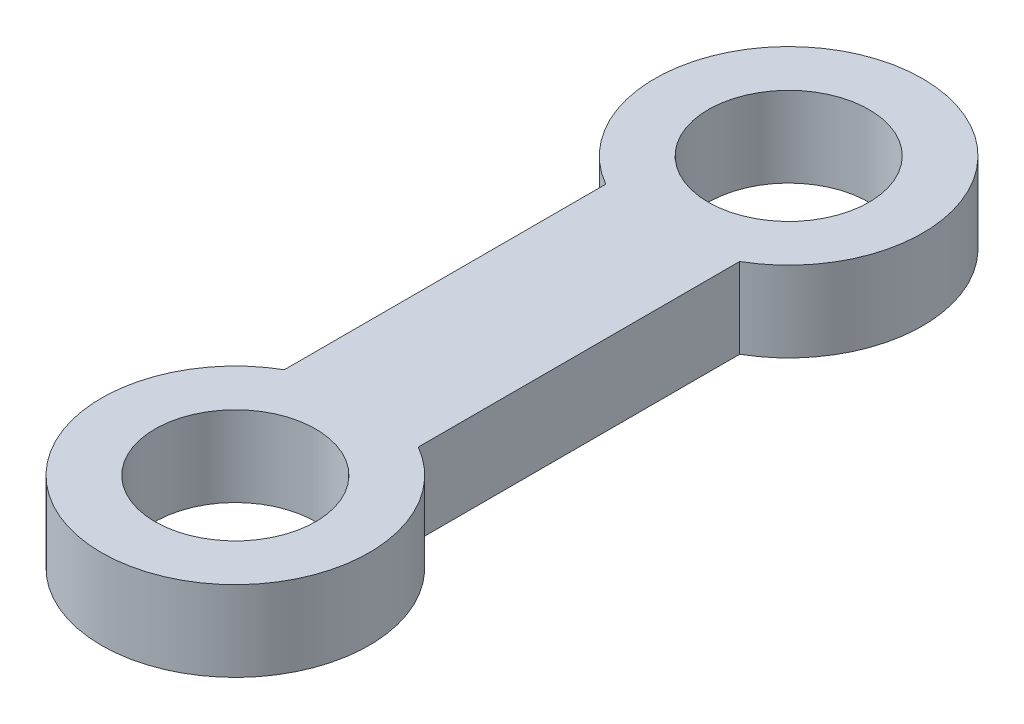
ISO-10303-21;
HEADER;
FILE_DESCRIPTION(('STEP AP214'),'2;1');
FILE_NAME('part.step','',(''),(''),'','','');
FILE_SCHEMA(('AUTOMOTIVE_DESIGN { 1 0 10303 214 1 1 1 1 }'));
ENDSEC;
DATA;
#1=APPLICATION_CONTEXT('core data for automotive mechanical design processes');
#2=APPLICATION_PROTOCOL_DEFINITION('international standard','automotive_design',2000,#1);
#3=PRODUCT_CONTEXT('',#1,'mechanical');
#4=PRODUCT('Part','Part','',(#3));
#5=PRODUCT_RELATED_PRODUCT_CATEGORY('part','',(#4));
#6=PRODUCT_DEFINITION_FORMATION('','',#4);
#7=PRODUCT_DEFINITION_CONTEXT('part definition',#1,'design');
#8=PRODUCT_DEFINITION('design','',#6,#7);
#9=PRODUCT_DEFINITION_SHAPE('','',#8);
#10=(LENGTH_UNIT() NAMED_UNIT(*) SI_UNIT(.MILLI.,.METRE.));
#11=(NAMED_UNIT(*) PLANE_ANGLE_UNIT() SI_UNIT($,.RADIAN.));
#12=(NAMED_UNIT(*) SI_UNIT($,.STERADIAN.) SOLID_ANGLE_UNIT());
#13=UNCERTAINTY_MEASURE_WITH_UNIT(LENGTH_MEASURE(1.E-05),#10,'distance_accuracy_value','');
#14=(GEOMETRIC_REPRESENTATION_CONTEXT(3) GLOBAL_UNCERTAINTY_ASSIGNED_CONTEXT((#13)) GLOBAL_UNIT_ASSIGNED_CONTEXT((#10,
#11,#12)) REPRESENTATION_CONTEXT('',''));
#15=CARTESIAN_POINT('',(0.,0.,0.));
#16=DIRECTION('',(0.,0.,1.));
#17=DIRECTION('',(1.,0.,0.));
#18=AXIS2_PLACEMENT_3D('',#15,#16,#17);
#19=CARTESIAN_POINT('',(0.,3.,0.));
#20=DIRECTION('',(0.,-1.,0.));
#21=DIRECTION('',(0.,0.,-1.));
#22=AXIS2_PLACEMENT_3D('',#19,#20,#21);
#23=CYLINDRICAL_SURFACE('',#22,3.);
#24=CARTESIAN_POINT('',(0.,3.,0.));
#25=DIRECTION('',(0.,1.,0.));
#26=DIRECTION('',(0.,0.,1.));
#27=AXIS2_PLACEMENT_3D('',#24,#25,#26);
#28=CIRCLE('',#27,3.);
#29=CARTESIAN_POINT('',(0.,3.,3.));
#30=VERTEX_POINT('',#29);
#31=EDGE_CURVE('E124',#30,#30,#28,.T.);
#32=ORIENTED_EDGE('',*,*,#31,.T.);
#33=EDGE_LOOP('',(#32));
#34=FACE_BOUND('',#33,.T.);
#35=CARTESIAN_POINT('',(0.,0.,0.));
#36=DIRECTION('',(0.,1.,0.));
#37=DIRECTION('',(0.,0.,1.));
#38=AXIS2_PLACEMENT_3D('',#35,#36,#37);
#39=CIRCLE('',#38,3.);
#40=CARTESIAN_POINT('',(0.,0.,3.));
#41=VERTEX_POINT('',#40);
#42=EDGE_CURVE('E112',#41,#41,#39,.T.);
#43=ORIENTED_EDGE('',*,*,#42,.F.);
#44=EDGE_LOOP('',(#43));
#45=FACE_BOUND('',#44,.T.);
#46=ADVANCED_FACE('F41',(#34,#45),#23,.F.);
#47=CARTESIAN_POINT('',(0.,3.,0.));
#48=DIRECTION('',(0.,-1.,0.));
#49=DIRECTION('',(0.,0.,-1.));
#50=AXIS2_PLACEMENT_3D('',#47,#48,#49);
#51=CYLINDRICAL_SURFACE('',#50,5.);
#52=CARTESIAN_POINT('',(0.,0.,0.));
#53=DIRECTION('',(0.,1.,0.));
#54=DIRECTION('',(0.,0.,1.));
#55=AXIS2_PLACEMENT_3D('',#52,#53,#54);
#56=CIRCLE('',#55,5.);
#57=CARTESIAN_POINT('',(2.5,0.,4.33012701892219));
#58=VERTEX_POINT('',#57);
#59=CARTESIAN_POINT('',(-2.5,0.,4.33012701892219));
#60=VERTEX_POINT('',#59);
#61=EDGE_CURVE('E99',#58,#60,#56,.T.);
#62=ORIENTED_EDGE('',*,*,#61,.T.);
#63=DIRECTION('',(0.,-1.,0.));
#64=VECTOR('',#63,1.);
#65=CARTESIAN_POINT('',(-2.5,3.,4.33012701892219));
#66=LINE('',#65,#64);
#67=CARTESIAN_POINT('',(-2.5,3.,4.33012701892219));
#68=VERTEX_POINT('',#67);
#69=EDGE_CURVE('E51',#68,#60,#66,.T.);
#70=ORIENTED_EDGE('',*,*,#69,.F.);
#71=CARTESIAN_POINT('',(0.,3.,0.));
#72=DIRECTION('',(0.,1.,0.));
#73=DIRECTION('',(0.,0.,1.));
#74=AXIS2_PLACEMENT_3D('',#71,#72,#73);
#75=CIRCLE('',#74,5.);
#76=CARTESIAN_POINT('',(2.5,3.,4.33012701892219));
#77=VERTEX_POINT('',#76);
#78=EDGE_CURVE('E119',#77,#68,#75,.T.);
#79=ORIENTED_EDGE('',*,*,#78,.F.);
#80=DIRECTION('',(0.,-1.,0.));
#81=VECTOR('',#80,1.);
#82=CARTESIAN_POINT('',(2.5,3.,4.33012701892219));
#83=LINE('',#82,#81);
#84=EDGE_CURVE('E11',#77,#58,#83,.T.);
#85=ORIENTED_EDGE('',*,*,#84,.T.);
#86=EDGE_LOOP('',(#62,#70,#79,#85));
#87=FACE_BOUND('',#86,.T.);
#88=ADVANCED_FACE('F134',(#87),#51,.T.);
#89=CARTESIAN_POINT('',(0.,3.,0.));
#90=DIRECTION('',(0.,1.,0.));
#91=DIRECTION('',(0.,0.,1.));
#92=AXIS2_PLACEMENT_3D('',#89,#90,#91);
#93=PLANE('',#92);
#94=ORIENTED_EDGE('',*,*,#31,.F.);
#95=EDGE_LOOP('',(#94));
#96=FACE_BOUND('',#95,.T.);
#97=ORIENTED_EDGE('',*,*,#78,.T.);
#98=DIRECTION('',(0.,0.,1.));
#99=VECTOR('',#98,1.);
#100=CARTESIAN_POINT('',(-2.5,3.,4.33012701892219));
#101=LINE('',#100,#99);
#102=CARTESIAN_POINT('',(-2.5,3.,16.3301270189222));
#103=VERTEX_POINT('',#102);
#104=EDGE_CURVE('E107',#68,#103,#101,.T.);
#105=ORIENTED_EDGE('',*,*,#104,.T.);
#106=CARTESIAN_POINT('',(0.,3.,20.6602540378444));
#107=DIRECTION('',(0.,1.,0.));
#108=DIRECTION('',(0.,0.,1.));
#109=AXIS2_PLACEMENT_3D('',#106,#107,#108);
#110=CIRCLE('',#109,5.);
#111=CARTESIAN_POINT('',(2.5,3.,16.3301270189222));
#112=VERTEX_POINT('',#111);
#113=EDGE_CURVE('E91',#103,#112,#110,.T.);
#114=ORIENTED_EDGE('',*,*,#113,.T.);
#115=DIRECTION('',(0.,0.,1.));
#116=VECTOR('',#115,1.);
#117=CARTESIAN_POINT('',(2.5,3.,4.33012701892219));
#118=LINE('',#117,#116);
#119=EDGE_CURVE('E89',#77,#112,#118,.T.);
#120=ORIENTED_EDGE('',*,*,#119,.F.);
#121=EDGE_LOOP('',(#97,#105,#114,#120));
#122=FACE_BOUND('',#121,.T.);
#123=CARTESIAN_POINT('',(0.,3.,20.6602540378444));
#124=DIRECTION('',(0.,1.,0.));
#125=DIRECTION('',(0.,0.,1.));
#126=AXIS2_PLACEMENT_3D('',#123,#124,#125);
#127=CIRCLE('',#126,3.);
#128=CARTESIAN_POINT('',(0.,3.,23.6602540378444));
#129=VERTEX_POINT('',#128);
#130=EDGE_CURVE('E101',#129,#129,#127,.T.);
#131=ORIENTED_EDGE('',*,*,#130,.F.);
#132=EDGE_LOOP('',(#131));
#133=FACE_BOUND('',#132,.T.);
#134=ADVANCED_FACE('F117',(#96,#122,#133),#93,.T.);
#135=CARTESIAN_POINT('',(0.,0.,0.));
#136=DIRECTION('',(0.,1.,0.));
#137=DIRECTION('',(0.,0.,1.));
#138=AXIS2_PLACEMENT_3D('',#135,#136,#137);
#139=PLANE('',#138);
#140=ORIENTED_EDGE('',*,*,#42,.T.);
#141=EDGE_LOOP('',(#140));
#142=FACE_BOUND('',#141,.T.);
#143=ORIENTED_EDGE('',*,*,#61,.F.);
#144=DIRECTION('',(0.,0.,1.));
#145=VECTOR('',#144,1.);
#146=CARTESIAN_POINT('',(2.5,0.,4.33012701892219));
#147=LINE('',#146,#145);
#148=CARTESIAN_POINT('',(2.5,0.,16.3301270189222));
#149=VERTEX_POINT('',#148);
#150=EDGE_CURVE('E86',#58,#149,#147,.T.);
#151=ORIENTED_EDGE('',*,*,#150,.T.);
#152=CARTESIAN_POINT('',(0.,0.,20.6602540378444));
#153=DIRECTION('',(0.,1.,0.));
#154=DIRECTION('',(0.,0.,1.));
#155=AXIS2_PLACEMENT_3D('',#152,#153,#154);
#156=CIRCLE('',#155,5.);
#157=CARTESIAN_POINT('',(-2.5,0.,16.3301270189222));
#158=VERTEX_POINT('',#157);
#159=EDGE_CURVE('E98',#158,#149,#156,.T.);
#160=ORIENTED_EDGE('',*,*,#159,.F.);
#161=DIRECTION('',(0.,0.,1.));
#162=VECTOR('',#161,1.);
#163=CARTESIAN_POINT('',(-2.5,0.,4.33012701892219));
#164=LINE('',#163,#162);
#165=EDGE_CURVE('E45',#60,#158,#164,.T.);
#166=ORIENTED_EDGE('',*,*,#165,.F.);
#167=EDGE_LOOP('',(#143,#151,#160,#166));
#168=FACE_BOUND('',#167,.T.);
#169=CARTESIAN_POINT('',(0.,0.,20.6602540378444));
#170=DIRECTION('',(0.,1.,0.));
#171=DIRECTION('',(0.,0.,1.));
#172=AXIS2_PLACEMENT_3D('',#169,#170,#171);
#173=CIRCLE('',#172,3.);
#174=CARTESIAN_POINT('',(0.,0.,23.6602540378444));
#175=VERTEX_POINT('',#174);
#176=EDGE_CURVE('E102',#175,#175,#173,.T.);
#177=ORIENTED_EDGE('',*,*,#176,.T.);
#178=EDGE_LOOP('',(#177));
#179=FACE_BOUND('',#178,.T.);
#180=ADVANCED_FACE('F95',(#142,#168,#179),#139,.F.);
#181=CARTESIAN_POINT('',(0.,3.,20.6602540378444));
#182=DIRECTION('',(0.,-1.,0.));
#183=DIRECTION('',(0.,0.,-1.));
#184=AXIS2_PLACEMENT_3D('',#181,#182,#183);
#185=CYLINDRICAL_SURFACE('',#184,3.);
#186=ORIENTED_EDGE('',*,*,#130,.T.);
#187=EDGE_LOOP('',(#186));
#188=FACE_BOUND('',#187,.T.);
#189=ORIENTED_EDGE('',*,*,#176,.F.);
#190=EDGE_LOOP('',(#189));
#191=FACE_BOUND('',#190,.T.);
#192=ADVANCED_FACE('F140',(#188,#191),#185,.F.);
#193=CARTESIAN_POINT('',(0.,3.,20.6602540378444));
#194=DIRECTION('',(0.,-1.,0.));
#195=DIRECTION('',(0.,0.,-1.));
#196=AXIS2_PLACEMENT_3D('',#193,#194,#195);
#197=CYLINDRICAL_SURFACE('',#196,5.);
#198=ORIENTED_EDGE('',*,*,#159,.T.);
#199=DIRECTION('',(0.,-1.,0.));
#200=VECTOR('',#199,1.);
#201=CARTESIAN_POINT('',(2.5,3.,16.3301270189222));
#202=LINE('',#201,#200);
#203=EDGE_CURVE('E84',#112,#149,#202,.T.);
#204=ORIENTED_EDGE('',*,*,#203,.F.);
#205=ORIENTED_EDGE('',*,*,#113,.F.);
#206=DIRECTION('',(0.,-1.,0.));
#207=VECTOR('',#206,1.);
#208=CARTESIAN_POINT('',(-2.5,3.,16.3301270189222));
#209=LINE('',#208,#207);
#210=EDGE_CURVE('E78',#103,#158,#209,.T.);
#211=ORIENTED_EDGE('',*,*,#210,.T.);
#212=EDGE_LOOP('',(#198,#204,#205,#211));
#213=FACE_BOUND('',#212,.T.);
#214=ADVANCED_FACE('F100',(#213),#197,.T.);
#215=CARTESIAN_POINT('',(-2.5,3.,4.33012701892219));
#216=DIRECTION('',(1.,0.,0.));
#217=DIRECTION('',(0.,0.,-1.));
#218=AXIS2_PLACEMENT_3D('',#215,#216,#217);
#219=PLANE('',#218);
#220=ORIENTED_EDGE('',*,*,#165,.T.);
#221=ORIENTED_EDGE('',*,*,#210,.F.);
#222=ORIENTED_EDGE('',*,*,#104,.F.);
#223=ORIENTED_EDGE('',*,*,#69,.T.);
#224=EDGE_LOOP('',(#220,#221,#222,#223));
#225=FACE_BOUND('',#224,.T.);
#226=ADVANCED_FACE('F145',(#225),#219,.F.);
#227=CARTESIAN_POINT('',(2.5,3.,4.33012701892219));
#228=DIRECTION('',(1.,0.,0.));
#229=DIRECTION('',(0.,0.,-1.));
#230=AXIS2_PLACEMENT_3D('',#227,#228,#229);
#231=PLANE('',#230);
#232=ORIENTED_EDGE('',*,*,#150,.F.);
#233=ORIENTED_EDGE('',*,*,#84,.F.);
#234=ORIENTED_EDGE('',*,*,#119,.T.);
#235=ORIENTED_EDGE('',*,*,#203,.T.);
#236=EDGE_LOOP('',(#232,#233,#234,#235));
#237=FACE_BOUND('',#236,.T.);
#238=ADVANCED_FACE('F43',(#237),#231,.T.);
#239=CLOSED_SHELL('',(#46,#88,#134,#180,#192,#214,#226,#238));
#240=MANIFOLD_SOLID_BREP('B2',#239);
#241=ADVANCED_BREP_SHAPE_REPRESENTATION('',(#18,#240),#14);
#242=SHAPE_DEFINITION_REPRESENTATION(#9,#241);
ENDSEC;
END-ISO-10303-21;
